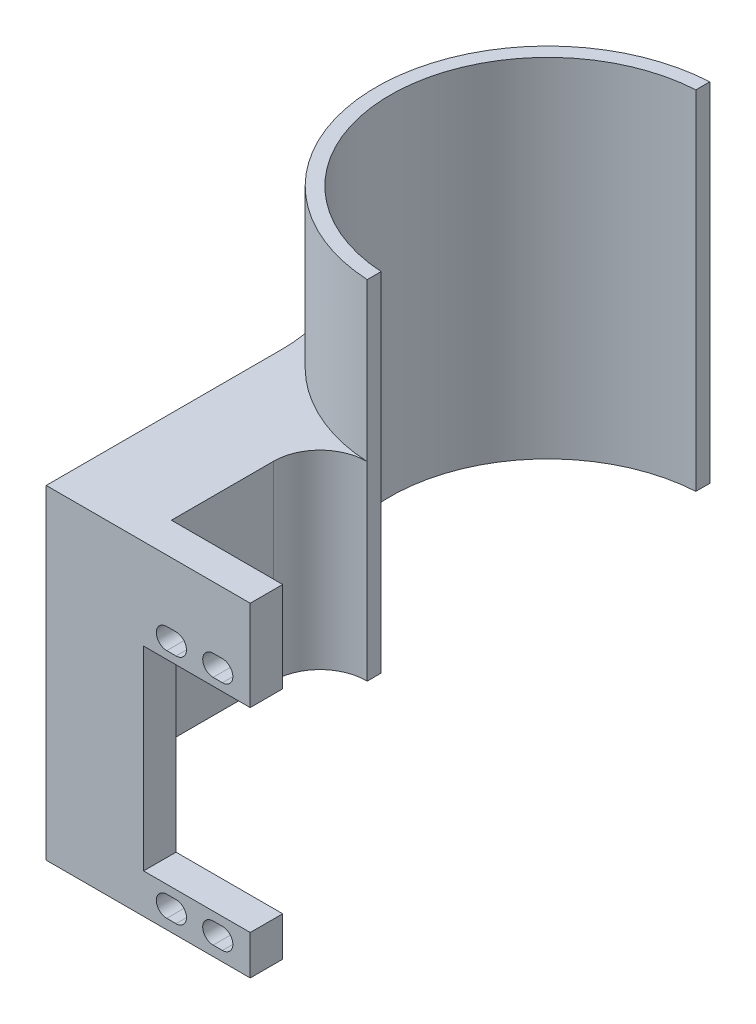
ISO-10303-21;
HEADER;
FILE_DESCRIPTION(('STEP AP214'),'2;1');
FILE_NAME('part.step','',(''),(''),'','','');
FILE_SCHEMA(('AUTOMOTIVE_DESIGN { 1 0 10303 214 1 1 1 1 }'));
ENDSEC;
DATA;
#1=APPLICATION_CONTEXT('core data for automotive mechanical design processes');
#2=APPLICATION_PROTOCOL_DEFINITION('international standard','automotive_design',2000,#1);
#3=PRODUCT_CONTEXT('',#1,'mechanical');
#4=PRODUCT('Part','Part','',(#3));
#5=PRODUCT_RELATED_PRODUCT_CATEGORY('part','',(#4));
#6=PRODUCT_DEFINITION_FORMATION('','',#4);
#7=PRODUCT_DEFINITION_CONTEXT('part definition',#1,'design');
#8=PRODUCT_DEFINITION('design','',#6,#7);
#9=PRODUCT_DEFINITION_SHAPE('','',#8);
#10=(LENGTH_UNIT() NAMED_UNIT(*) SI_UNIT(.MILLI.,.METRE.));
#11=(NAMED_UNIT(*) PLANE_ANGLE_UNIT() SI_UNIT($,.RADIAN.));
#12=(NAMED_UNIT(*) SI_UNIT($,.STERADIAN.) SOLID_ANGLE_UNIT());
#13=UNCERTAINTY_MEASURE_WITH_UNIT(LENGTH_MEASURE(1.E-05),#10,'distance_accuracy_value','');
#14=(GEOMETRIC_REPRESENTATION_CONTEXT(3) GLOBAL_UNCERTAINTY_ASSIGNED_CONTEXT((#13)) GLOBAL_UNIT_ASSIGNED_CONTEXT((#10,
#11,#12)) REPRESENTATION_CONTEXT('',''));
#15=CARTESIAN_POINT('',(0.,0.,0.));
#16=DIRECTION('',(0.,0.,1.));
#17=DIRECTION('',(1.,0.,0.));
#18=AXIS2_PLACEMENT_3D('',#15,#16,#17);
#19=CARTESIAN_POINT('',(11.9999999999999,-22.8999999999999,59.5761671920241));
#20=DIRECTION('',(1.,0.,0.));
#21=DIRECTION('',(0.,1.,0.));
#22=AXIS2_PLACEMENT_3D('',#19,#20,#21);
#23=PLANE('',#22);
#24=DIRECTION('',(0.,0.,-1.));
#25=VECTOR('',#24,1.);
#26=CARTESIAN_POINT('',(11.9999999999999,-42.4,59.5761671920242));
#27=LINE('',#26,#25);
#28=CARTESIAN_POINT('',(11.9999999999999,-42.4,59.5761671920242));
#29=VERTEX_POINT('',#28);
#30=CARTESIAN_POINT('',(11.9999999999999,-42.4,52.5761671920241));
#31=VERTEX_POINT('',#30);
#32=EDGE_CURVE('E395',#29,#31,#27,.T.);
#33=ORIENTED_EDGE('',*,*,#32,.T.);
#34=DIRECTION('',(0.,-1.,0.));
#35=VECTOR('',#34,1.);
#36=CARTESIAN_POINT('',(11.9999999999999,-22.8999999999999,52.5761671920241));
#37=LINE('',#36,#35);
#38=CARTESIAN_POINT('',(11.9999999999999,-22.8999999999999,52.5761671920241));
#39=VERTEX_POINT('',#38);
#40=EDGE_CURVE('E449',#39,#31,#37,.T.);
#41=ORIENTED_EDGE('',*,*,#40,.F.);
#42=DIRECTION('',(0.,0.,1.));
#43=VECTOR('',#42,1.);
#44=CARTESIAN_POINT('',(11.9999999999999,-22.8999999999999,59.5761671920241));
#45=LINE('',#44,#43);
#46=CARTESIAN_POINT('',(11.9999999999999,-22.8999999999999,59.5761671920241));
#47=VERTEX_POINT('',#46);
#48=EDGE_CURVE('E422',#39,#47,#45,.T.);
#49=ORIENTED_EDGE('',*,*,#48,.T.);
#50=DIRECTION('',(0.,-1.,0.));
#51=VECTOR('',#50,1.);
#52=CARTESIAN_POINT('',(11.9999999999999,-22.8999999999999,59.5761671920241));
#53=LINE('',#52,#51);
#54=EDGE_CURVE('E445',#47,#29,#53,.T.);
#55=ORIENTED_EDGE('',*,*,#54,.T.);
#56=EDGE_LOOP('',(#33,#41,#49,#55));
#57=FACE_BOUND('',#56,.T.);
#58=ADVANCED_FACE('F33',(#57),#23,.T.);
#59=CARTESIAN_POINT('',(-12.0000000000001,-22.9,52.5761671920241));
#60=DIRECTION('',(1.,0.,0.));
#61=DIRECTION('',(0.,1.,0.));
#62=AXIS2_PLACEMENT_3D('',#59,#60,#61);
#63=PLANE('',#62);
#64=DIRECTION('',(0.,0.,-1.));
#65=VECTOR('',#64,1.);
#66=CARTESIAN_POINT('',(-12.,-63.9,18.5158969481452));
#67=LINE('',#66,#65);
#68=CARTESIAN_POINT('',(-12.,-63.9,52.5761671920242));
#69=VERTEX_POINT('',#68);
#70=CARTESIAN_POINT('',(-12.,-63.9,30.5205603022688));
#71=VERTEX_POINT('',#70);
#72=EDGE_CURVE('E408',#69,#71,#67,.T.);
#73=ORIENTED_EDGE('',*,*,#72,.T.);
#74=DIRECTION('',(0.,-1.,0.));
#75=VECTOR('',#74,1.);
#76=CARTESIAN_POINT('',(-12.0000000000001,-22.9,30.5205603022688));
#77=LINE('',#76,#75);
#78=CARTESIAN_POINT('',(-12.0000000000001,-22.9,30.5205603022688));
#79=VERTEX_POINT('',#78);
#80=EDGE_CURVE('E497',#71,#79,#77,.F.);
#81=ORIENTED_EDGE('',*,*,#80,.T.);
#82=DIRECTION('',(0.,0.,1.));
#83=VECTOR('',#82,1.);
#84=CARTESIAN_POINT('',(-12.0000000000001,-22.9,52.5761671920241));
#85=LINE('',#84,#83);
#86=CARTESIAN_POINT('',(-12.0000000000001,-22.9,52.5761671920241));
#87=VERTEX_POINT('',#86);
#88=EDGE_CURVE('E416',#79,#87,#85,.T.);
#89=ORIENTED_EDGE('',*,*,#88,.T.);
#90=DIRECTION('',(0.,-1.,0.));
#91=VECTOR('',#90,1.);
#92=CARTESIAN_POINT('',(-12.0000000000001,-22.9,52.5761671920241));
#93=LINE('',#92,#91);
#94=EDGE_CURVE('E431',#87,#69,#93,.T.);
#95=ORIENTED_EDGE('',*,*,#94,.T.);
#96=EDGE_LOOP('',(#73,#81,#89,#95));
#97=FACE_BOUND('',#96,.T.);
#98=ADVANCED_FACE('F506',(#97),#63,.T.);
#99=CARTESIAN_POINT('',(0.173562069242392,-63.9,-16.4190588916441));
#100=DIRECTION('',(0.,1.,0.));
#101=DIRECTION('',(-1.,0.,0.));
#102=AXIS2_PLACEMENT_3D('',#99,#100,#101);
#103=CYLINDRICAL_SURFACE('',#102,34.);
#104=CARTESIAN_POINT('',(0.173562069242354,11.1,-16.4190588916441));
#105=DIRECTION('',(0.,1.,0.));
#106=DIRECTION('',(1.,0.,0.));
#107=AXIS2_PLACEMENT_3D('',#104,#105,#106);
#108=CIRCLE('',#107,34.);
#109=CARTESIAN_POINT('',(-1.82643793075764,11.1,-50.3601843885984));
#110=VERTEX_POINT('',#109);
#111=CARTESIAN_POINT('',(-1.82643793075765,11.1,17.5220666053102));
#112=VERTEX_POINT('',#111);
#113=EDGE_CURVE('E444',#110,#112,#108,.T.);
#114=ORIENTED_EDGE('',*,*,#113,.T.);
#115=DIRECTION('',(0.,1.,0.));
#116=VECTOR('',#115,1.);
#117=CARTESIAN_POINT('',(-1.82643793075761,-63.9,17.5220666053102));
#118=LINE('',#117,#116);
#119=CARTESIAN_POINT('',(-1.82643793075761,-63.9,17.5220666053102));
#120=VERTEX_POINT('',#119);
#121=EDGE_CURVE('E484',#120,#112,#118,.T.);
#122=ORIENTED_EDGE('',*,*,#121,.F.);
#123=CARTESIAN_POINT('',(0.173562069242392,-63.9,-16.4190588916441));
#124=DIRECTION('',(0.,1.,0.));
#125=DIRECTION('',(1.,0.,0.));
#126=AXIS2_PLACEMENT_3D('',#123,#124,#125);
#127=CIRCLE('',#126,34.);
#128=CARTESIAN_POINT('',(-1.8264379307576,-63.9,-50.3601843885984));
#129=VERTEX_POINT('',#128);
#130=EDGE_CURVE('E455',#129,#120,#127,.T.);
#131=ORIENTED_EDGE('',*,*,#130,.F.);
#132=DIRECTION('',(0.,1.,0.));
#133=VECTOR('',#132,1.);
#134=CARTESIAN_POINT('',(-1.8264379307576,-63.9,-50.3601843885984));
#135=LINE('',#134,#133);
#136=EDGE_CURVE('E466',#129,#110,#135,.T.);
#137=ORIENTED_EDGE('',*,*,#136,.T.);
#138=EDGE_LOOP('',(#114,#122,#131,#137));
#139=FACE_BOUND('',#138,.T.);
#140=ADVANCED_FACE('F571',(#139),#103,.F.);
#141=CARTESIAN_POINT('',(-1.82643793075761,-63.9,17.5220666053102));
#142=DIRECTION('',(-1.,0.,0.));
#143=DIRECTION('',(0.,-1.,0.));
#144=AXIS2_PLACEMENT_3D('',#141,#142,#143);
#145=PLANE('',#144);
#146=DIRECTION('',(0.,0.,1.));
#147=VECTOR('',#146,1.);
#148=CARTESIAN_POINT('',(-1.82643793075765,11.1,17.5220666053102));
#149=LINE('',#148,#147);
#150=CARTESIAN_POINT('',(-1.82643793075765,11.1,20.5220666053102));
#151=VERTEX_POINT('',#150);
#152=EDGE_CURVE('E469',#112,#151,#149,.T.);
#153=ORIENTED_EDGE('',*,*,#152,.T.);
#154=DIRECTION('',(0.,1.,0.));
#155=VECTOR('',#154,1.);
#156=CARTESIAN_POINT('',(-1.82643793075761,-63.9,20.5220666053102));
#157=LINE('',#156,#155);
#158=CARTESIAN_POINT('',(-1.82643793075764,-22.9,20.5220666053102));
#159=VERTEX_POINT('',#158);
#160=EDGE_CURVE('E480',#159,#151,#157,.T.);
#161=ORIENTED_EDGE('',*,*,#160,.F.);
#162=CARTESIAN_POINT('',(-1.82643793075761,-63.9,20.5220666053102));
#163=VERTEX_POINT('',#162);
#164=EDGE_CURVE('E481',#163,#159,#157,.T.);
#165=ORIENTED_EDGE('',*,*,#164,.F.);
#166=DIRECTION('',(0.,0.,1.));
#167=VECTOR('',#166,1.);
#168=CARTESIAN_POINT('',(-1.82643793075761,-63.9,17.5220666053102));
#169=LINE('',#168,#167);
#170=EDGE_CURVE('E458',#120,#163,#169,.T.);
#171=ORIENTED_EDGE('',*,*,#170,.F.);
#172=ORIENTED_EDGE('',*,*,#121,.T.);
#173=EDGE_LOOP('',(#153,#161,#165,#171,#172));
#174=FACE_BOUND('',#173,.T.);
#175=ADVANCED_FACE('F515',(#174),#145,.F.);
#176=CARTESIAN_POINT('',(0.173562069242392,-63.9,-16.4190588916441));
#177=DIRECTION('',(0.,1.,0.));
#178=DIRECTION('',(-1.,0.,0.));
#179=AXIS2_PLACEMENT_3D('',#176,#177,#178);
#180=CYLINDRICAL_SURFACE('',#179,36.9952260836682);
#181=CARTESIAN_POINT('',(0.173562069242283,-22.9,-16.4190588916441));
#182=DIRECTION('',(0.,1.,0.));
#183=DIRECTION('',(1.,0.,0.));
#184=AXIS2_PLACEMENT_3D('',#181,#182,#183);
#185=CIRCLE('',#184,36.9952260836682);
#186=CARTESIAN_POINT('',(-34.1591078781066,-22.9,-2.63811091016867));
#187=VERTEX_POINT('',#186);
#188=EDGE_CURVE('E414',#187,#159,#185,.T.);
#189=ORIENTED_EDGE('',*,*,#188,.T.);
#190=ORIENTED_EDGE('',*,*,#160,.T.);
#191=CARTESIAN_POINT('',(0.173562069242354,11.1,-16.4190588916441));
#192=DIRECTION('',(0.,-1.,0.));
#193=DIRECTION('',(1.,0.,0.));
#194=AXIS2_PLACEMENT_3D('',#191,#192,#193);
#195=CIRCLE('',#194,36.9952260836682);
#196=CARTESIAN_POINT('',(-1.82643793075764,11.1,-53.3601843885984));
#197=VERTEX_POINT('',#196);
#198=EDGE_CURVE('E472',#151,#197,#195,.T.);
#199=ORIENTED_EDGE('',*,*,#198,.T.);
#200=DIRECTION('',(0.,1.,0.));
#201=VECTOR('',#200,1.);
#202=CARTESIAN_POINT('',(-1.8264379307576,-63.9,-53.3601843885984));
#203=LINE('',#202,#201);
#204=CARTESIAN_POINT('',(-1.8264379307576,-63.9,-53.3601843885984));
#205=VERTEX_POINT('',#204);
#206=EDGE_CURVE('E477',#205,#197,#203,.T.);
#207=ORIENTED_EDGE('',*,*,#206,.F.);
#208=CARTESIAN_POINT('',(0.173562069242392,-63.9,-16.4190588916441));
#209=DIRECTION('',(0.,-1.,0.));
#210=DIRECTION('',(1.,0.,0.));
#211=AXIS2_PLACEMENT_3D('',#208,#209,#210);
#212=CIRCLE('',#211,36.9952260836682);
#213=CARTESIAN_POINT('',(-34.1591078781065,-63.9,-2.63811091016868));
#214=VERTEX_POINT('',#213);
#215=EDGE_CURVE('E462',#214,#205,#212,.T.);
#216=ORIENTED_EDGE('',*,*,#215,.F.);
#217=DIRECTION('',(0.,1.,0.));
#218=VECTOR('',#217,1.);
#219=CARTESIAN_POINT('',(-34.1591078781065,-63.9,-2.63811091016868));
#220=LINE('',#219,#218);
#221=EDGE_CURVE('E490',#214,#187,#220,.T.);
#222=ORIENTED_EDGE('',*,*,#221,.T.);
#223=EDGE_LOOP('',(#189,#190,#199,#207,#216,#222));
#224=FACE_BOUND('',#223,.T.);
#225=ADVANCED_FACE('F518',(#224),#180,.T.);
#226=CARTESIAN_POINT('',(-1.8264379307576,-63.9,-50.3601843885984));
#227=DIRECTION('',(-1.,0.,0.));
#228=DIRECTION('',(0.,-1.,0.));
#229=AXIS2_PLACEMENT_3D('',#226,#227,#228);
#230=PLANE('',#229);
#231=DIRECTION('',(0.,0.,1.));
#232=VECTOR('',#231,1.);
#233=CARTESIAN_POINT('',(-1.82643793075764,11.1,-50.3601843885984));
#234=LINE('',#233,#232);
#235=EDGE_CURVE('E459',#197,#110,#234,.T.);
#236=ORIENTED_EDGE('',*,*,#235,.T.);
#237=ORIENTED_EDGE('',*,*,#136,.F.);
#238=DIRECTION('',(0.,0.,1.));
#239=VECTOR('',#238,1.);
#240=CARTESIAN_POINT('',(-1.8264379307576,-63.9,-50.3601843885984));
#241=LINE('',#240,#239);
#242=EDGE_CURVE('E464',#205,#129,#241,.T.);
#243=ORIENTED_EDGE('',*,*,#242,.F.);
#244=ORIENTED_EDGE('',*,*,#206,.T.);
#245=EDGE_LOOP('',(#236,#237,#243,#244));
#246=FACE_BOUND('',#245,.T.);
#247=ADVANCED_FACE('F816',(#246),#230,.F.);
#248=CARTESIAN_POINT('',(0.173562069242392,-63.9,-16.4190588916441));
#249=DIRECTION('',(0.,-1.,0.));
#250=DIRECTION('',(1.,0.,0.));
#251=AXIS2_PLACEMENT_3D('',#248,#249,#250);
#252=PLANE('',#251);
#253=ORIENTED_EDGE('',*,*,#130,.T.);
#254=ORIENTED_EDGE('',*,*,#170,.T.);
#255=CARTESIAN_POINT('',(-2.00000000000003,-63.9,30.5205603022688));
#256=DIRECTION('',(0.,-1.,0.));
#257=DIRECTION('',(1.,0.,0.));
#258=AXIS2_PLACEMENT_3D('',#255,#256,#257);
#259=CIRCLE('',#258,10.);
#260=EDGE_CURVE('E41',#163,#71,#259,.F.);
#261=ORIENTED_EDGE('',*,*,#260,.T.);
#262=ORIENTED_EDGE('',*,*,#72,.F.);
#263=DIRECTION('',(1.,0.,0.));
#264=VECTOR('',#263,1.);
#265=CARTESIAN_POINT('',(-12.0000000000001,-63.9,52.5761671920242));
#266=LINE('',#265,#264);
#267=CARTESIAN_POINT('',(-32.0000000000001,-63.9,52.5761671920242));
#268=VERTEX_POINT('',#267);
#269=EDGE_CURVE('E404',#268,#69,#266,.T.);
#270=ORIENTED_EDGE('',*,*,#269,.F.);
#271=DIRECTION('',(0.,0.,1.));
#272=VECTOR('',#271,1.);
#273=CARTESIAN_POINT('',(-32.,-63.9,52.5761671920241));
#274=LINE('',#273,#272);
#275=CARTESIAN_POINT('',(-32.,-63.9,8.5370725718637));
#276=VERTEX_POINT('',#275);
#277=EDGE_CURVE('E406',#276,#268,#274,.T.);
#278=ORIENTED_EDGE('',*,*,#277,.F.);
#279=CARTESIAN_POINT('',(-62.,-63.9,8.53707257186369));
#280=DIRECTION('',(0.,-1.,0.));
#281=DIRECTION('',(1.,0.,0.));
#282=AXIS2_PLACEMENT_3D('',#279,#280,#281);
#283=CIRCLE('',#282,30.);
#284=EDGE_CURVE('E493',#276,#214,#283,.F.);
#285=ORIENTED_EDGE('',*,*,#284,.T.);
#286=ORIENTED_EDGE('',*,*,#215,.T.);
#287=ORIENTED_EDGE('',*,*,#242,.T.);
#288=EDGE_LOOP('',(#253,#254,#261,#262,#270,#278,#285,#286,#287));
#289=FACE_BOUND('',#288,.T.);
#290=ADVANCED_FACE('F500',(#289),#252,.T.);
#291=CARTESIAN_POINT('',(0.173562069242354,11.1,-16.4190588916441));
#292=DIRECTION('',(0.,-1.,0.));
#293=DIRECTION('',(1.,0.,0.));
#294=AXIS2_PLACEMENT_3D('',#291,#292,#293);
#295=PLANE('',#294);
#296=ORIENTED_EDGE('',*,*,#113,.F.);
#297=ORIENTED_EDGE('',*,*,#235,.F.);
#298=ORIENTED_EDGE('',*,*,#198,.F.);
#299=ORIENTED_EDGE('',*,*,#152,.F.);
#300=EDGE_LOOP('',(#296,#297,#298,#299));
#301=FACE_BOUND('',#300,.T.);
#302=ADVANCED_FACE('F584',(#301),#295,.F.);
#303=CARTESIAN_POINT('',(-32.0000000000001,-22.9,1.84316049041164));
#304=DIRECTION('',(-1.,0.,0.));
#305=DIRECTION('',(0.,-1.,0.));
#306=AXIS2_PLACEMENT_3D('',#303,#304,#305);
#307=PLANE('',#306);
#308=DIRECTION('',(0.,0.,-1.));
#309=VECTOR('',#308,1.);
#310=CARTESIAN_POINT('',(-32.0000000000001,-22.9,1.84316049041164));
#311=LINE('',#310,#309);
#312=CARTESIAN_POINT('',(-32.0000000000001,-22.9,59.5761671920241));
#313=VERTEX_POINT('',#312);
#314=CARTESIAN_POINT('',(-32.0000000000001,-22.9,8.5370725718637));
#315=VERTEX_POINT('',#314);
#316=EDGE_CURVE('E428',#313,#315,#311,.T.);
#317=ORIENTED_EDGE('',*,*,#316,.T.);
#318=DIRECTION('',(0.,1.,0.));
#319=VECTOR('',#318,1.);
#320=CARTESIAN_POINT('',(-32.0000000000001,-22.9,8.5370725718637));
#321=LINE('',#320,#319);
#322=EDGE_CURVE('E487',#315,#276,#321,.F.);
#323=ORIENTED_EDGE('',*,*,#322,.T.);
#324=ORIENTED_EDGE('',*,*,#277,.T.);
#325=DIRECTION('',(0.,-1.,0.));
#326=VECTOR('',#325,1.);
#327=CARTESIAN_POINT('',(-32.0000000000001,-9.3670927880618,52.5761671920241));
#328=LINE('',#327,#326);
#329=CARTESIAN_POINT('',(-32.,-92.9,52.5761671920242));
#330=VERTEX_POINT('',#329);
#331=EDGE_CURVE('E398',#268,#330,#328,.T.);
#332=ORIENTED_EDGE('',*,*,#331,.T.);
#333=DIRECTION('',(0.,0.,-1.));
#334=VECTOR('',#333,1.);
#335=CARTESIAN_POINT('',(-32.,-92.9,1.84316049041168));
#336=LINE('',#335,#334);
#337=CARTESIAN_POINT('',(-32.,-92.9,59.5761671920242));
#338=VERTEX_POINT('',#337);
#339=EDGE_CURVE('E417',#338,#330,#336,.T.);
#340=ORIENTED_EDGE('',*,*,#339,.F.);
#341=DIRECTION('',(0.,-1.,0.));
#342=VECTOR('',#341,1.);
#343=CARTESIAN_POINT('',(-32.0000000000001,-22.9,59.5761671920241));
#344=LINE('',#343,#342);
#345=EDGE_CURVE('E442',#313,#338,#344,.T.);
#346=ORIENTED_EDGE('',*,*,#345,.F.);
#347=EDGE_LOOP('',(#317,#323,#324,#332,#340,#346));
#348=FACE_BOUND('',#347,.T.);
#349=ADVANCED_FACE('F529',(#348),#307,.T.);
#350=CARTESIAN_POINT('',(-32.0000000000001,-22.9,59.5761671920241));
#351=DIRECTION('',(0.,0.,1.));
#352=DIRECTION('',(0.,-1.,0.));
#353=AXIS2_PLACEMENT_3D('',#350,#351,#352);
#354=PLANE('',#353);
#355=CARTESIAN_POINT('',(-4.00000000000004,-88.5,59.5761671920242));
#356=DIRECTION('',(0.,0.,-1.));
#357=DIRECTION('',(0.,1.,0.));
#358=AXIS2_PLACEMENT_3D('',#355,#356,#357);
#359=CIRCLE('',#358,2.25);
#360=CARTESIAN_POINT('',(-4.00000000000004,-86.25,59.5761671920242));
#361=VERTEX_POINT('',#360);
#362=CARTESIAN_POINT('',(-4.00000000000004,-90.75,59.5761671920242));
#363=VERTEX_POINT('',#362);
#364=EDGE_CURVE('E247',#361,#363,#359,.T.);
#365=ORIENTED_EDGE('',*,*,#364,.T.);
#366=DIRECTION('',(-1.,0.,0.));
#367=VECTOR('',#366,1.);
#368=CARTESIAN_POINT('',(-4.00000000000004,-90.75,59.5761671920242));
#369=LINE('',#368,#367);
#370=CARTESIAN_POINT('',(-6.00000000000004,-90.75,59.5761671920242));
#371=VERTEX_POINT('',#370);
#372=EDGE_CURVE('E256',#363,#371,#369,.T.);
#373=ORIENTED_EDGE('',*,*,#372,.T.);
#374=CARTESIAN_POINT('',(-6.00000000000004,-88.5,59.5761671920242));
#375=DIRECTION('',(0.,0.,-1.));
#376=DIRECTION('',(0.,1.,0.));
#377=AXIS2_PLACEMENT_3D('',#374,#375,#376);
#378=CIRCLE('',#377,2.25);
#379=CARTESIAN_POINT('',(-6.00000000000004,-86.25,59.5761671920242));
#380=VERTEX_POINT('',#379);
#381=EDGE_CURVE('E48',#371,#380,#378,.T.);
#382=ORIENTED_EDGE('',*,*,#381,.T.);
#383=DIRECTION('',(1.,0.,0.));
#384=VECTOR('',#383,1.);
#385=CARTESIAN_POINT('',(-4.00000000000004,-86.25,59.5761671920242));
#386=LINE('',#385,#384);
#387=EDGE_CURVE('E253',#380,#361,#386,.T.);
#388=ORIENTED_EDGE('',*,*,#387,.T.);
#389=EDGE_LOOP('',(#365,#373,#382,#388));
#390=FACE_BOUND('',#389,.T.);
#391=CARTESIAN_POINT('',(5.99999999999996,-88.5,59.5761671920242));
#392=DIRECTION('',(0.,0.,-1.));
#393=DIRECTION('',(0.,1.,0.));
#394=AXIS2_PLACEMENT_3D('',#391,#392,#393);
#395=CIRCLE('',#394,2.25);
#396=CARTESIAN_POINT('',(5.99999999999996,-86.25,59.5761671920242));
#397=VERTEX_POINT('',#396);
#398=CARTESIAN_POINT('',(5.99999999999996,-90.75,59.5761671920242));
#399=VERTEX_POINT('',#398);
#400=EDGE_CURVE('E282',#397,#399,#395,.T.);
#401=ORIENTED_EDGE('',*,*,#400,.T.);
#402=DIRECTION('',(-1.,0.,0.));
#403=VECTOR('',#402,1.);
#404=CARTESIAN_POINT('',(5.99999999999996,-90.75,59.5761671920242));
#405=LINE('',#404,#403);
#406=CARTESIAN_POINT('',(3.99999999999996,-90.75,59.5761671920242));
#407=VERTEX_POINT('',#406);
#408=EDGE_CURVE('E285',#399,#407,#405,.T.);
#409=ORIENTED_EDGE('',*,*,#408,.T.);
#410=CARTESIAN_POINT('',(3.99999999999996,-88.5,59.5761671920242));
#411=DIRECTION('',(0.,0.,-1.));
#412=DIRECTION('',(0.,1.,0.));
#413=AXIS2_PLACEMENT_3D('',#410,#411,#412);
#414=CIRCLE('',#413,2.25);
#415=CARTESIAN_POINT('',(3.99999999999996,-86.25,59.5761671920242));
#416=VERTEX_POINT('',#415);
#417=EDGE_CURVE('E289',#407,#416,#414,.T.);
#418=ORIENTED_EDGE('',*,*,#417,.T.);
#419=DIRECTION('',(1.,0.,0.));
#420=VECTOR('',#419,1.);
#421=CARTESIAN_POINT('',(5.99999999999996,-86.25,59.5761671920242));
#422=LINE('',#421,#420);
#423=EDGE_CURVE('E292',#416,#397,#422,.T.);
#424=ORIENTED_EDGE('',*,*,#423,.T.);
#425=EDGE_LOOP('',(#401,#409,#418,#424));
#426=FACE_BOUND('',#425,.T.);
#427=CARTESIAN_POINT('',(-4.00000000000003,-38.5,59.5761671920242));
#428=DIRECTION('',(0.,0.,-1.));
#429=DIRECTION('',(0.,1.,0.));
#430=AXIS2_PLACEMENT_3D('',#427,#428,#429);
#431=CIRCLE('',#430,2.25);
#432=CARTESIAN_POINT('',(-4.00000000000003,-36.25,59.5761671920242));
#433=VERTEX_POINT('',#432);
#434=CARTESIAN_POINT('',(-4.00000000000003,-40.75,59.5761671920242));
#435=VERTEX_POINT('',#434);
#436=EDGE_CURVE('E314',#433,#435,#431,.T.);
#437=ORIENTED_EDGE('',*,*,#436,.T.);
#438=DIRECTION('',(-1.,0.,0.));
#439=VECTOR('',#438,1.);
#440=CARTESIAN_POINT('',(-4.00000000000003,-40.75,59.5761671920242));
#441=LINE('',#440,#439);
#442=CARTESIAN_POINT('',(-6.00000000000003,-40.75,59.5761671920241));
#443=VERTEX_POINT('',#442);
#444=EDGE_CURVE('E317',#435,#443,#441,.T.);
#445=ORIENTED_EDGE('',*,*,#444,.T.);
#446=CARTESIAN_POINT('',(-6.00000000000003,-38.5,59.5761671920242));
#447=DIRECTION('',(0.,0.,-1.));
#448=DIRECTION('',(0.,1.,0.));
#449=AXIS2_PLACEMENT_3D('',#446,#447,#448);
#450=CIRCLE('',#449,2.25);
#451=CARTESIAN_POINT('',(-6.00000000000003,-36.25,59.5761671920242));
#452=VERTEX_POINT('',#451);
#453=EDGE_CURVE('E321',#443,#452,#450,.T.);
#454=ORIENTED_EDGE('',*,*,#453,.T.);
#455=DIRECTION('',(1.,0.,0.));
#456=VECTOR('',#455,1.);
#457=CARTESIAN_POINT('',(-4.00000000000003,-36.25,59.5761671920242));
#458=LINE('',#457,#456);
#459=EDGE_CURVE('E324',#452,#433,#458,.T.);
#460=ORIENTED_EDGE('',*,*,#459,.T.);
#461=EDGE_LOOP('',(#437,#445,#454,#460));
#462=FACE_BOUND('',#461,.T.);
#463=CARTESIAN_POINT('',(5.99999999999997,-38.5,59.5761671920242));
#464=DIRECTION('',(0.,0.,-1.));
#465=DIRECTION('',(0.,1.,0.));
#466=AXIS2_PLACEMENT_3D('',#463,#464,#465);
#467=CIRCLE('',#466,2.25);
#468=CARTESIAN_POINT('',(5.99999999999997,-36.25,59.5761671920242));
#469=VERTEX_POINT('',#468);
#470=CARTESIAN_POINT('',(5.99999999999997,-40.75,59.5761671920242));
#471=VERTEX_POINT('',#470);
#472=EDGE_CURVE('E346',#469,#471,#467,.T.);
#473=ORIENTED_EDGE('',*,*,#472,.T.);
#474=DIRECTION('',(-1.,0.,0.));
#475=VECTOR('',#474,1.);
#476=CARTESIAN_POINT('',(5.99999999999997,-40.75,59.5761671920242));
#477=LINE('',#476,#475);
#478=CARTESIAN_POINT('',(3.99999999999997,-40.75,59.5761671920241));
#479=VERTEX_POINT('',#478);
#480=EDGE_CURVE('E349',#471,#479,#477,.T.);
#481=ORIENTED_EDGE('',*,*,#480,.T.);
#482=CARTESIAN_POINT('',(3.99999999999997,-38.5,59.5761671920242));
#483=DIRECTION('',(0.,0.,-1.));
#484=DIRECTION('',(0.,1.,0.));
#485=AXIS2_PLACEMENT_3D('',#482,#483,#484);
#486=CIRCLE('',#485,2.25);
#487=CARTESIAN_POINT('',(3.99999999999997,-36.25,59.5761671920242));
#488=VERTEX_POINT('',#487);
#489=EDGE_CURVE('E353',#479,#488,#486,.T.);
#490=ORIENTED_EDGE('',*,*,#489,.T.);
#491=DIRECTION('',(1.,0.,0.));
#492=VECTOR('',#491,1.);
#493=CARTESIAN_POINT('',(5.99999999999997,-36.25,59.5761671920242));
#494=LINE('',#493,#492);
#495=EDGE_CURVE('E356',#488,#469,#494,.T.);
#496=ORIENTED_EDGE('',*,*,#495,.T.);
#497=EDGE_LOOP('',(#473,#481,#490,#496));
#498=FACE_BOUND('',#497,.T.);
#499=DIRECTION('',(1.,0.,0.));
#500=VECTOR('',#499,1.);
#501=CARTESIAN_POINT('',(11.9999999999999,-42.4,59.5761671920242));
#502=LINE('',#501,#500);
#503=CARTESIAN_POINT('',(-11.,-42.4,59.5761671920242));
#504=VERTEX_POINT('',#503);
#505=EDGE_CURVE('E385',#504,#29,#502,.T.);
#506=ORIENTED_EDGE('',*,*,#505,.T.);
#507=ORIENTED_EDGE('',*,*,#54,.F.);
#508=DIRECTION('',(-1.,0.,0.));
#509=VECTOR('',#508,1.);
#510=CARTESIAN_POINT('',(-32.0000000000001,-22.9,59.5761671920241));
#511=LINE('',#510,#509);
#512=EDGE_CURVE('E425',#47,#313,#511,.T.);
#513=ORIENTED_EDGE('',*,*,#512,.T.);
#514=ORIENTED_EDGE('',*,*,#345,.T.);
#515=DIRECTION('',(-1.,0.,0.));
#516=VECTOR('',#515,1.);
#517=CARTESIAN_POINT('',(-32.,-92.9,59.5761671920242));
#518=LINE('',#517,#516);
#519=CARTESIAN_POINT('',(12.,-92.8999999999999,59.5761671920242));
#520=VERTEX_POINT('',#519);
#521=EDGE_CURVE('E437',#520,#338,#518,.T.);
#522=ORIENTED_EDGE('',*,*,#521,.F.);
#523=CARTESIAN_POINT('',(11.9999999999999,-84.4,59.5761671920242));
#524=VERTEX_POINT('',#523);
#525=EDGE_CURVE('E448',#524,#520,#53,.T.);
#526=ORIENTED_EDGE('',*,*,#525,.F.);
#527=DIRECTION('',(-1.,0.,0.));
#528=VECTOR('',#527,1.);
#529=CARTESIAN_POINT('',(11.9999999999999,-84.4,59.5761671920242));
#530=LINE('',#529,#528);
#531=CARTESIAN_POINT('',(-11.,-84.4,59.5761671920242));
#532=VERTEX_POINT('',#531);
#533=EDGE_CURVE('E378',#524,#532,#530,.T.);
#534=ORIENTED_EDGE('',*,*,#533,.T.);
#535=DIRECTION('',(0.,1.,0.));
#536=VECTOR('',#535,1.);
#537=CARTESIAN_POINT('',(-11.,-42.4,59.5761671920242));
#538=LINE('',#537,#536);
#539=EDGE_CURVE('E381',#532,#504,#538,.T.);
#540=ORIENTED_EDGE('',*,*,#539,.T.);
#541=EDGE_LOOP('',(#506,#507,#513,#514,#522,#526,#534,#540));
#542=FACE_BOUND('',#541,.T.);
#543=ADVANCED_FACE('F260',(#390,#426,#462,#498,#542),#354,.T.);
#544=DIRECTION('',(0.,0.,-1.));
#545=VECTOR('',#544,1.);
#546=CARTESIAN_POINT('',(11.9999999999999,-84.4,59.5761671920242));
#547=LINE('',#546,#545);
#548=CARTESIAN_POINT('',(12.,-84.4,52.5761671920242));
#549=VERTEX_POINT('',#548);
#550=EDGE_CURVE('E388',#524,#549,#547,.T.);
#551=ORIENTED_EDGE('',*,*,#550,.F.);
#552=ORIENTED_EDGE('',*,*,#525,.T.);
#553=DIRECTION('',(0.,0.,1.));
#554=VECTOR('',#553,1.);
#555=CARTESIAN_POINT('',(12.,-92.8999999999999,59.5761671920242));
#556=LINE('',#555,#554);
#557=CARTESIAN_POINT('',(12.,-92.8999999999999,52.5761671920242));
#558=VERTEX_POINT('',#557);
#559=EDGE_CURVE('E434',#558,#520,#556,.T.);
#560=ORIENTED_EDGE('',*,*,#559,.F.);
#561=EDGE_CURVE('E452',#549,#558,#37,.T.);
#562=ORIENTED_EDGE('',*,*,#561,.F.);
#563=EDGE_LOOP('',(#551,#552,#560,#562));
#564=FACE_BOUND('',#563,.T.);
#565=ADVANCED_FACE('F547',(#564),#23,.T.);
#566=CARTESIAN_POINT('',(11.9999999999999,-22.8999999999999,52.5761671920241));
#567=DIRECTION('',(0.,0.,-1.));
#568=DIRECTION('',(-1.,0.,0.));
#569=AXIS2_PLACEMENT_3D('',#566,#567,#568);
#570=PLANE('',#569);
#571=CARTESIAN_POINT('',(-4.00000000000004,-88.5,52.5761671920242));
#572=DIRECTION('',(0.,0.,-1.));
#573=DIRECTION('',(0.,1.,0.));
#574=AXIS2_PLACEMENT_3D('',#571,#572,#573);
#575=CIRCLE('',#574,2.25);
#576=CARTESIAN_POINT('',(-4.00000000000004,-86.25,52.5761671920242));
#577=VERTEX_POINT('',#576);
#578=CARTESIAN_POINT('',(-4.00000000000005,-90.75,52.5761671920242));
#579=VERTEX_POINT('',#578);
#580=EDGE_CURVE('E56',#577,#579,#575,.T.);
#581=ORIENTED_EDGE('',*,*,#580,.F.);
#582=DIRECTION('',(1.,0.,0.));
#583=VECTOR('',#582,1.);
#584=CARTESIAN_POINT('',(-4.00000000000004,-86.25,52.5761671920242));
#585=LINE('',#584,#583);
#586=CARTESIAN_POINT('',(-6.00000000000004,-86.25,52.5761671920242));
#587=VERTEX_POINT('',#586);
#588=EDGE_CURVE('E263',#587,#577,#585,.T.);
#589=ORIENTED_EDGE('',*,*,#588,.F.);
#590=CARTESIAN_POINT('',(-6.00000000000004,-88.5,52.5761671920242));
#591=DIRECTION('',(0.,0.,-1.));
#592=DIRECTION('',(0.,1.,0.));
#593=AXIS2_PLACEMENT_3D('',#590,#591,#592);
#594=CIRCLE('',#593,2.25);
#595=CARTESIAN_POINT('',(-6.00000000000004,-90.75,52.5761671920242));
#596=VERTEX_POINT('',#595);
#597=EDGE_CURVE('E266',#596,#587,#594,.T.);
#598=ORIENTED_EDGE('',*,*,#597,.F.);
#599=DIRECTION('',(-1.,0.,0.));
#600=VECTOR('',#599,1.);
#601=CARTESIAN_POINT('',(-4.00000000000004,-90.75,52.5761671920242));
#602=LINE('',#601,#600);
#603=EDGE_CURVE('E272',#579,#596,#602,.T.);
#604=ORIENTED_EDGE('',*,*,#603,.F.);
#605=EDGE_LOOP('',(#581,#589,#598,#604));
#606=FACE_BOUND('',#605,.T.);
#607=CARTESIAN_POINT('',(5.99999999999996,-88.5,52.5761671920242));
#608=DIRECTION('',(0.,0.,-1.));
#609=DIRECTION('',(0.,1.,0.));
#610=AXIS2_PLACEMENT_3D('',#607,#608,#609);
#611=CIRCLE('',#610,2.25);
#612=CARTESIAN_POINT('',(5.99999999999996,-86.25,52.5761671920242));
#613=VERTEX_POINT('',#612);
#614=CARTESIAN_POINT('',(5.99999999999996,-90.75,52.5761671920242));
#615=VERTEX_POINT('',#614);
#616=EDGE_CURVE('E278',#613,#615,#611,.T.);
#617=ORIENTED_EDGE('',*,*,#616,.F.);
#618=DIRECTION('',(1.,0.,0.));
#619=VECTOR('',#618,1.);
#620=CARTESIAN_POINT('',(5.99999999999996,-86.25,52.5761671920242));
#621=LINE('',#620,#619);
#622=CARTESIAN_POINT('',(3.99999999999996,-86.25,52.5761671920242));
#623=VERTEX_POINT('',#622);
#624=EDGE_CURVE('E286',#623,#613,#621,.T.);
#625=ORIENTED_EDGE('',*,*,#624,.F.);
#626=CARTESIAN_POINT('',(3.99999999999996,-88.5,52.5761671920242));
#627=DIRECTION('',(0.,0.,-1.));
#628=DIRECTION('',(0.,1.,0.));
#629=AXIS2_PLACEMENT_3D('',#626,#627,#628);
#630=CIRCLE('',#629,2.25);
#631=CARTESIAN_POINT('',(3.99999999999996,-90.75,52.5761671920242));
#632=VERTEX_POINT('',#631);
#633=EDGE_CURVE('E300',#632,#623,#630,.T.);
#634=ORIENTED_EDGE('',*,*,#633,.F.);
#635=DIRECTION('',(-1.,0.,0.));
#636=VECTOR('',#635,1.);
#637=CARTESIAN_POINT('',(5.99999999999996,-90.75,52.5761671920242));
#638=LINE('',#637,#636);
#639=EDGE_CURVE('E297',#615,#632,#638,.T.);
#640=ORIENTED_EDGE('',*,*,#639,.F.);
#641=EDGE_LOOP('',(#617,#625,#634,#640));
#642=FACE_BOUND('',#641,.T.);
#643=CARTESIAN_POINT('',(-4.00000000000003,-38.5,52.5761671920241));
#644=DIRECTION('',(0.,0.,-1.));
#645=DIRECTION('',(0.,1.,0.));
#646=AXIS2_PLACEMENT_3D('',#643,#644,#645);
#647=CIRCLE('',#646,2.25);
#648=CARTESIAN_POINT('',(-4.00000000000003,-36.25,52.5761671920241));
#649=VERTEX_POINT('',#648);
#650=CARTESIAN_POINT('',(-4.00000000000003,-40.75,52.5761671920241));
#651=VERTEX_POINT('',#650);
#652=EDGE_CURVE('E307',#649,#651,#647,.T.);
#653=ORIENTED_EDGE('',*,*,#652,.F.);
#654=DIRECTION('',(1.,0.,0.));
#655=VECTOR('',#654,1.);
#656=CARTESIAN_POINT('',(-4.00000000000003,-36.25,52.5761671920241));
#657=LINE('',#656,#655);
#658=CARTESIAN_POINT('',(-6.00000000000003,-36.25,52.5761671920241));
#659=VERTEX_POINT('',#658);
#660=EDGE_CURVE('E318',#659,#649,#657,.T.);
#661=ORIENTED_EDGE('',*,*,#660,.F.);
#662=CARTESIAN_POINT('',(-6.00000000000003,-38.5,52.5761671920241));
#663=DIRECTION('',(0.,0.,-1.));
#664=DIRECTION('',(0.,1.,0.));
#665=AXIS2_PLACEMENT_3D('',#662,#663,#664);
#666=CIRCLE('',#665,2.25);
#667=CARTESIAN_POINT('',(-6.00000000000003,-40.75,52.5761671920241));
#668=VERTEX_POINT('',#667);
#669=EDGE_CURVE('E332',#668,#659,#666,.T.);
#670=ORIENTED_EDGE('',*,*,#669,.F.);
#671=DIRECTION('',(-1.,0.,0.));
#672=VECTOR('',#671,1.);
#673=CARTESIAN_POINT('',(-4.00000000000003,-40.75,52.5761671920241));
#674=LINE('',#673,#672);
#675=EDGE_CURVE('E329',#651,#668,#674,.T.);
#676=ORIENTED_EDGE('',*,*,#675,.F.);
#677=EDGE_LOOP('',(#653,#661,#670,#676));
#678=FACE_BOUND('',#677,.T.);
#679=CARTESIAN_POINT('',(5.99999999999997,-38.5,52.5761671920241));
#680=DIRECTION('',(0.,0.,-1.));
#681=DIRECTION('',(0.,1.,0.));
#682=AXIS2_PLACEMENT_3D('',#679,#680,#681);
#683=CIRCLE('',#682,2.25);
#684=CARTESIAN_POINT('',(5.99999999999997,-36.25,52.5761671920241));
#685=VERTEX_POINT('',#684);
#686=CARTESIAN_POINT('',(5.99999999999997,-40.75,52.5761671920241));
#687=VERTEX_POINT('',#686);
#688=EDGE_CURVE('E339',#685,#687,#683,.T.);
#689=ORIENTED_EDGE('',*,*,#688,.F.);
#690=DIRECTION('',(1.,0.,0.));
#691=VECTOR('',#690,1.);
#692=CARTESIAN_POINT('',(5.99999999999997,-36.25,52.5761671920241));
#693=LINE('',#692,#691);
#694=CARTESIAN_POINT('',(3.99999999999997,-36.25,52.5761671920241));
#695=VERTEX_POINT('',#694);
#696=EDGE_CURVE('E350',#695,#685,#693,.T.);
#697=ORIENTED_EDGE('',*,*,#696,.F.);
#698=CARTESIAN_POINT('',(3.99999999999997,-38.5,52.5761671920241));
#699=DIRECTION('',(0.,0.,-1.));
#700=DIRECTION('',(0.,1.,0.));
#701=AXIS2_PLACEMENT_3D('',#698,#699,#700);
#702=CIRCLE('',#701,2.25);
#703=CARTESIAN_POINT('',(3.99999999999997,-40.75,52.5761671920241));
#704=VERTEX_POINT('',#703);
#705=EDGE_CURVE('E364',#704,#695,#702,.T.);
#706=ORIENTED_EDGE('',*,*,#705,.F.);
#707=DIRECTION('',(-1.,0.,0.));
#708=VECTOR('',#707,1.);
#709=CARTESIAN_POINT('',(5.99999999999997,-40.75,52.5761671920241));
#710=LINE('',#709,#708);
#711=EDGE_CURVE('E361',#687,#704,#710,.T.);
#712=ORIENTED_EDGE('',*,*,#711,.F.);
#713=EDGE_LOOP('',(#689,#697,#706,#712));
#714=FACE_BOUND('',#713,.T.);
#715=DIRECTION('',(1.,0.,0.));
#716=VECTOR('',#715,1.);
#717=CARTESIAN_POINT('',(11.9999999999999,-42.4,52.5761671920241));
#718=LINE('',#717,#716);
#719=CARTESIAN_POINT('',(-11.,-42.4,52.5761671920241));
#720=VERTEX_POINT('',#719);
#721=EDGE_CURVE('E382',#720,#31,#718,.T.);
#722=ORIENTED_EDGE('',*,*,#721,.F.);
#723=DIRECTION('',(0.,1.,0.));
#724=VECTOR('',#723,1.);
#725=CARTESIAN_POINT('',(-11.,-42.4,52.5761671920241));
#726=LINE('',#725,#724);
#727=CARTESIAN_POINT('',(-11.,-84.4,52.5761671920242));
#728=VERTEX_POINT('',#727);
#729=EDGE_CURVE('E391',#728,#720,#726,.T.);
#730=ORIENTED_EDGE('',*,*,#729,.F.);
#731=DIRECTION('',(-1.,0.,0.));
#732=VECTOR('',#731,1.);
#733=CARTESIAN_POINT('',(11.9999999999999,-84.4,52.5761671920242));
#734=LINE('',#733,#732);
#735=EDGE_CURVE('E371',#549,#728,#734,.T.);
#736=ORIENTED_EDGE('',*,*,#735,.F.);
#737=ORIENTED_EDGE('',*,*,#561,.T.);
#738=DIRECTION('',(1.,0.,0.));
#739=VECTOR('',#738,1.);
#740=CARTESIAN_POINT('',(12.,-92.8999999999999,52.5761671920242));
#741=LINE('',#740,#739);
#742=EDGE_CURVE('E413',#330,#558,#741,.T.);
#743=ORIENTED_EDGE('',*,*,#742,.F.);
#744=ORIENTED_EDGE('',*,*,#331,.F.);
#745=ORIENTED_EDGE('',*,*,#269,.T.);
#746=ORIENTED_EDGE('',*,*,#94,.F.);
#747=DIRECTION('',(1.,0.,0.));
#748=VECTOR('',#747,1.);
#749=CARTESIAN_POINT('',(11.9999999999999,-22.8999999999999,52.5761671920241));
#750=LINE('',#749,#748);
#751=EDGE_CURVE('E419',#87,#39,#750,.T.);
#752=ORIENTED_EDGE('',*,*,#751,.T.);
#753=ORIENTED_EDGE('',*,*,#40,.T.);
#754=EDGE_LOOP('',(#722,#730,#736,#737,#743,#744,#745,#746,#752,#753));
#755=FACE_BOUND('',#754,.T.);
#756=ADVANCED_FACE('F538',(#606,#642,#678,#714,#755),#570,.T.);
#757=CARTESIAN_POINT('',(0.173562069242283,-22.9,-16.4190588916441));
#758=DIRECTION('',(0.,-1.,0.));
#759=DIRECTION('',(1.,0.,0.));
#760=AXIS2_PLACEMENT_3D('',#757,#758,#759);
#761=PLANE('',#760);
#762=ORIENTED_EDGE('',*,*,#188,.F.);
#763=CARTESIAN_POINT('',(-62.,-22.9000000000001,8.53707257186369));
#764=DIRECTION('',(0.,-1.,0.));
#765=DIRECTION('',(1.,0.,0.));
#766=AXIS2_PLACEMENT_3D('',#763,#764,#765);
#767=CIRCLE('',#766,30.);
#768=EDGE_CURVE('E495',#187,#315,#767,.T.);
#769=ORIENTED_EDGE('',*,*,#768,.T.);
#770=ORIENTED_EDGE('',*,*,#316,.F.);
#771=ORIENTED_EDGE('',*,*,#512,.F.);
#772=ORIENTED_EDGE('',*,*,#48,.F.);
#773=ORIENTED_EDGE('',*,*,#751,.F.);
#774=ORIENTED_EDGE('',*,*,#88,.F.);
#775=CARTESIAN_POINT('',(-2.00000000000005,-22.9,30.5205603022688));
#776=DIRECTION('',(0.,-1.,0.));
#777=DIRECTION('',(1.,0.,0.));
#778=AXIS2_PLACEMENT_3D('',#775,#776,#777);
#779=CIRCLE('',#778,10.);
#780=EDGE_CURVE('E11',#79,#159,#779,.T.);
#781=ORIENTED_EDGE('',*,*,#780,.T.);
#782=EDGE_LOOP('',(#762,#769,#770,#771,#772,#773,#774,#781));
#783=FACE_BOUND('',#782,.T.);
#784=ADVANCED_FACE('F512',(#783),#761,.F.);
#785=CARTESIAN_POINT('',(0.173562069242377,-92.9,-16.4190588916441));
#786=DIRECTION('',(0.,-1.,0.));
#787=DIRECTION('',(1.,0.,0.));
#788=AXIS2_PLACEMENT_3D('',#785,#786,#787);
#789=PLANE('',#788);
#790=ORIENTED_EDGE('',*,*,#339,.T.);
#791=ORIENTED_EDGE('',*,*,#742,.T.);
#792=ORIENTED_EDGE('',*,*,#559,.T.);
#793=ORIENTED_EDGE('',*,*,#521,.T.);
#794=EDGE_LOOP('',(#790,#791,#792,#793));
#795=FACE_BOUND('',#794,.T.);
#796=ADVANCED_FACE('F542',(#795),#789,.T.);
#797=CARTESIAN_POINT('',(-62.,-63.9000000000001,8.53707257186369));
#798=DIRECTION('',(0.,1.,0.));
#799=DIRECTION('',(-1.,0.,0.));
#800=AXIS2_PLACEMENT_3D('',#797,#798,#799);
#801=CYLINDRICAL_SURFACE('',#800,30.);
#802=ORIENTED_EDGE('',*,*,#768,.F.);
#803=ORIENTED_EDGE('',*,*,#221,.F.);
#804=ORIENTED_EDGE('',*,*,#284,.F.);
#805=ORIENTED_EDGE('',*,*,#322,.F.);
#806=EDGE_LOOP('',(#802,#803,#804,#805));
#807=FACE_BOUND('',#806,.T.);
#808=ADVANCED_FACE('F525',(#807),#801,.F.);
#809=CARTESIAN_POINT('',(-2.00000000000003,-63.9,30.5205603022688));
#810=DIRECTION('',(0.,1.,0.));
#811=DIRECTION('',(-1.,0.,0.));
#812=AXIS2_PLACEMENT_3D('',#809,#810,#811);
#813=CYLINDRICAL_SURFACE('',#812,10.);
#814=ORIENTED_EDGE('',*,*,#780,.F.);
#815=ORIENTED_EDGE('',*,*,#80,.F.);
#816=ORIENTED_EDGE('',*,*,#260,.F.);
#817=ORIENTED_EDGE('',*,*,#164,.T.);
#818=EDGE_LOOP('',(#814,#815,#816,#817));
#819=FACE_BOUND('',#818,.T.);
#820=ADVANCED_FACE('F35',(#819),#813,.F.);
#821=CARTESIAN_POINT('',(11.9999999999999,-42.4,59.5761671920242));
#822=DIRECTION('',(0.,1.,0.));
#823=DIRECTION('',(0.,0.,1.));
#824=AXIS2_PLACEMENT_3D('',#821,#822,#823);
#825=PLANE('',#824);
#826=ORIENTED_EDGE('',*,*,#721,.T.);
#827=ORIENTED_EDGE('',*,*,#32,.F.);
#828=ORIENTED_EDGE('',*,*,#505,.F.);
#829=DIRECTION('',(0.,0.,-1.));
#830=VECTOR('',#829,1.);
#831=CARTESIAN_POINT('',(-11.,-42.4,59.5761671920242));
#832=LINE('',#831,#830);
#833=EDGE_CURVE('E399',#504,#720,#832,.T.);
#834=ORIENTED_EDGE('',*,*,#833,.T.);
#835=EDGE_LOOP('',(#826,#827,#828,#834));
#836=FACE_BOUND('',#835,.T.);
#837=ADVANCED_FACE('F557',(#836),#825,.F.);
#838=CARTESIAN_POINT('',(-11.,-42.4,59.5761671920242));
#839=DIRECTION('',(-1.,0.,0.));
#840=DIRECTION('',(0.,-1.,0.));
#841=AXIS2_PLACEMENT_3D('',#838,#839,#840);
#842=PLANE('',#841);
#843=ORIENTED_EDGE('',*,*,#729,.T.);
#844=ORIENTED_EDGE('',*,*,#833,.F.);
#845=ORIENTED_EDGE('',*,*,#539,.F.);
#846=DIRECTION('',(0.,0.,-1.));
#847=VECTOR('',#846,1.);
#848=CARTESIAN_POINT('',(-11.,-84.4,59.5761671920242));
#849=LINE('',#848,#847);
#850=EDGE_CURVE('E401',#532,#728,#849,.T.);
#851=ORIENTED_EDGE('',*,*,#850,.T.);
#852=EDGE_LOOP('',(#843,#844,#845,#851));
#853=FACE_BOUND('',#852,.T.);
#854=ADVANCED_FACE('F553',(#853),#842,.F.);
#855=CARTESIAN_POINT('',(11.9999999999999,-84.4,59.5761671920242));
#856=DIRECTION('',(0.,-1.,0.));
#857=DIRECTION('',(0.,0.,-1.));
#858=AXIS2_PLACEMENT_3D('',#855,#856,#857);
#859=PLANE('',#858);
#860=ORIENTED_EDGE('',*,*,#735,.T.);
#861=ORIENTED_EDGE('',*,*,#850,.F.);
#862=ORIENTED_EDGE('',*,*,#533,.F.);
#863=ORIENTED_EDGE('',*,*,#550,.T.);
#864=EDGE_LOOP('',(#860,#861,#862,#863));
#865=FACE_BOUND('',#864,.T.);
#866=ADVANCED_FACE('F551',(#865),#859,.F.);
#867=CARTESIAN_POINT('',(5.99999999999997,-38.5,59.5761671920242));
#868=DIRECTION('',(0.,0.,-1.));
#869=DIRECTION('',(0.,1.,0.));
#870=AXIS2_PLACEMENT_3D('',#867,#868,#869);
#871=CYLINDRICAL_SURFACE('',#870,2.25);
#872=ORIENTED_EDGE('',*,*,#688,.T.);
#873=DIRECTION('',(0.,0.,-1.));
#874=VECTOR('',#873,1.);
#875=CARTESIAN_POINT('',(5.99999999999997,-40.75,59.5761671920242));
#876=LINE('',#875,#874);
#877=EDGE_CURVE('E359',#471,#687,#876,.T.);
#878=ORIENTED_EDGE('',*,*,#877,.F.);
#879=ORIENTED_EDGE('',*,*,#472,.F.);
#880=DIRECTION('',(0.,0.,-1.));
#881=VECTOR('',#880,1.);
#882=CARTESIAN_POINT('',(5.99999999999997,-36.25,59.5761671920242));
#883=LINE('',#882,#881);
#884=EDGE_CURVE('E369',#469,#685,#883,.T.);
#885=ORIENTED_EDGE('',*,*,#884,.T.);
#886=EDGE_LOOP('',(#872,#878,#879,#885));
#887=FACE_BOUND('',#886,.T.);
#888=ADVANCED_FACE('F592',(#887),#871,.F.);
#889=CARTESIAN_POINT('',(5.99999999999997,-36.25,59.5761671920242));
#890=DIRECTION('',(0.,1.,0.));
#891=DIRECTION('',(0.,0.,1.));
#892=AXIS2_PLACEMENT_3D('',#889,#890,#891);
#893=PLANE('',#892);
#894=ORIENTED_EDGE('',*,*,#696,.T.);
#895=ORIENTED_EDGE('',*,*,#884,.F.);
#896=ORIENTED_EDGE('',*,*,#495,.F.);
#897=DIRECTION('',(0.,0.,-1.));
#898=VECTOR('',#897,1.);
#899=CARTESIAN_POINT('',(3.99999999999997,-36.25,59.5761671920242));
#900=LINE('',#899,#898);
#901=EDGE_CURVE('E372',#488,#695,#900,.T.);
#902=ORIENTED_EDGE('',*,*,#901,.T.);
#903=EDGE_LOOP('',(#894,#895,#896,#902));
#904=FACE_BOUND('',#903,.T.);
#905=ADVANCED_FACE('F596',(#904),#893,.F.);
#906=CARTESIAN_POINT('',(3.99999999999997,-38.5,59.5761671920242));
#907=DIRECTION('',(0.,0.,-1.));
#908=DIRECTION('',(0.,1.,0.));
#909=AXIS2_PLACEMENT_3D('',#906,#907,#908);
#910=CYLINDRICAL_SURFACE('',#909,2.25);
#911=ORIENTED_EDGE('',*,*,#705,.T.);
#912=ORIENTED_EDGE('',*,*,#901,.F.);
#913=ORIENTED_EDGE('',*,*,#489,.F.);
#914=DIRECTION('',(0.,0.,-1.));
#915=VECTOR('',#914,1.);
#916=CARTESIAN_POINT('',(3.99999999999997,-40.75,59.5761671920242));
#917=LINE('',#916,#915);
#918=EDGE_CURVE('E374',#479,#704,#917,.T.);
#919=ORIENTED_EDGE('',*,*,#918,.T.);
#920=EDGE_LOOP('',(#911,#912,#913,#919));
#921=FACE_BOUND('',#920,.T.);
#922=ADVANCED_FACE('F601',(#921),#910,.F.);
#923=CARTESIAN_POINT('',(5.99999999999997,-40.75,59.5761671920242));
#924=DIRECTION('',(0.,-1.,0.));
#925=DIRECTION('',(0.,0.,-1.));
#926=AXIS2_PLACEMENT_3D('',#923,#924,#925);
#927=PLANE('',#926);
#928=ORIENTED_EDGE('',*,*,#711,.T.);
#929=ORIENTED_EDGE('',*,*,#918,.F.);
#930=ORIENTED_EDGE('',*,*,#480,.F.);
#931=ORIENTED_EDGE('',*,*,#877,.T.);
#932=EDGE_LOOP('',(#928,#929,#930,#931));
#933=FACE_BOUND('',#932,.T.);
#934=ADVANCED_FACE('F605',(#933),#927,.F.);
#935=CARTESIAN_POINT('',(-4.00000000000003,-38.5,59.5761671920242));
#936=DIRECTION('',(0.,0.,-1.));
#937=DIRECTION('',(0.,1.,0.));
#938=AXIS2_PLACEMENT_3D('',#935,#936,#937);
#939=CYLINDRICAL_SURFACE('',#938,2.25);
#940=ORIENTED_EDGE('',*,*,#652,.T.);
#941=DIRECTION('',(0.,0.,-1.));
#942=VECTOR('',#941,1.);
#943=CARTESIAN_POINT('',(-4.00000000000003,-40.75,59.5761671920242));
#944=LINE('',#943,#942);
#945=EDGE_CURVE('E327',#435,#651,#944,.T.);
#946=ORIENTED_EDGE('',*,*,#945,.F.);
#947=ORIENTED_EDGE('',*,*,#436,.F.);
#948=DIRECTION('',(0.,0.,-1.));
#949=VECTOR('',#948,1.);
#950=CARTESIAN_POINT('',(-4.00000000000003,-36.25,59.5761671920242));
#951=LINE('',#950,#949);
#952=EDGE_CURVE('E337',#433,#649,#951,.T.);
#953=ORIENTED_EDGE('',*,*,#952,.T.);
#954=EDGE_LOOP('',(#940,#946,#947,#953));
#955=FACE_BOUND('',#954,.T.);
#956=ADVANCED_FACE('F608',(#955),#939,.F.);
#957=CARTESIAN_POINT('',(-4.00000000000003,-36.25,59.5761671920242));
#958=DIRECTION('',(0.,1.,0.));
#959=DIRECTION('',(0.,0.,1.));
#960=AXIS2_PLACEMENT_3D('',#957,#958,#959);
#961=PLANE('',#960);
#962=ORIENTED_EDGE('',*,*,#660,.T.);
#963=ORIENTED_EDGE('',*,*,#952,.F.);
#964=ORIENTED_EDGE('',*,*,#459,.F.);
#965=DIRECTION('',(0.,0.,-1.));
#966=VECTOR('',#965,1.);
#967=CARTESIAN_POINT('',(-6.00000000000003,-36.25,59.5761671920242));
#968=LINE('',#967,#966);
#969=EDGE_CURVE('E340',#452,#659,#968,.T.);
#970=ORIENTED_EDGE('',*,*,#969,.T.);
#971=EDGE_LOOP('',(#962,#963,#964,#970));
#972=FACE_BOUND('',#971,.T.);
#973=ADVANCED_FACE('F615',(#972),#961,.F.);
#974=CARTESIAN_POINT('',(-6.00000000000003,-38.5,59.5761671920242));
#975=DIRECTION('',(0.,0.,-1.));
#976=DIRECTION('',(0.,1.,0.));
#977=AXIS2_PLACEMENT_3D('',#974,#975,#976);
#978=CYLINDRICAL_SURFACE('',#977,2.25);
#979=ORIENTED_EDGE('',*,*,#669,.T.);
#980=ORIENTED_EDGE('',*,*,#969,.F.);
#981=ORIENTED_EDGE('',*,*,#453,.F.);
#982=DIRECTION('',(0.,0.,-1.));
#983=VECTOR('',#982,1.);
#984=CARTESIAN_POINT('',(-6.00000000000003,-40.75,59.5761671920242));
#985=LINE('',#984,#983);
#986=EDGE_CURVE('E342',#443,#668,#985,.T.);
#987=ORIENTED_EDGE('',*,*,#986,.T.);
#988=EDGE_LOOP('',(#979,#980,#981,#987));
#989=FACE_BOUND('',#988,.T.);
#990=ADVANCED_FACE('F621',(#989),#978,.F.);
#991=CARTESIAN_POINT('',(-4.00000000000003,-40.75,59.5761671920242));
#992=DIRECTION('',(0.,-1.,0.));
#993=DIRECTION('',(0.,0.,-1.));
#994=AXIS2_PLACEMENT_3D('',#991,#992,#993);
#995=PLANE('',#994);
#996=ORIENTED_EDGE('',*,*,#675,.T.);
#997=ORIENTED_EDGE('',*,*,#986,.F.);
#998=ORIENTED_EDGE('',*,*,#444,.F.);
#999=ORIENTED_EDGE('',*,*,#945,.T.);
#1000=EDGE_LOOP('',(#996,#997,#998,#999));
#1001=FACE_BOUND('',#1000,.T.);
#1002=ADVANCED_FACE('F617',(#1001),#995,.F.);
#1003=CARTESIAN_POINT('',(5.99999999999996,-88.5,59.5761671920242));
#1004=DIRECTION('',(0.,0.,-1.));
#1005=DIRECTION('',(0.,1.,0.));
#1006=AXIS2_PLACEMENT_3D('',#1003,#1004,#1005);
#1007=CYLINDRICAL_SURFACE('',#1006,2.25);
#1008=ORIENTED_EDGE('',*,*,#616,.T.);
#1009=DIRECTION('',(0.,0.,-1.));
#1010=VECTOR('',#1009,1.);
#1011=CARTESIAN_POINT('',(5.99999999999996,-90.75,59.5761671920242));
#1012=LINE('',#1011,#1010);
#1013=EDGE_CURVE('E295',#399,#615,#1012,.T.);
#1014=ORIENTED_EDGE('',*,*,#1013,.F.);
#1015=ORIENTED_EDGE('',*,*,#400,.F.);
#1016=DIRECTION('',(0.,0.,-1.));
#1017=VECTOR('',#1016,1.);
#1018=CARTESIAN_POINT('',(5.99999999999996,-86.25,59.5761671920242));
#1019=LINE('',#1018,#1017);
#1020=EDGE_CURVE('E305',#397,#613,#1019,.T.);
#1021=ORIENTED_EDGE('',*,*,#1020,.T.);
#1022=EDGE_LOOP('',(#1008,#1014,#1015,#1021));
#1023=FACE_BOUND('',#1022,.T.);
#1024=ADVANCED_FACE('F620',(#1023),#1007,.F.);
#1025=CARTESIAN_POINT('',(5.99999999999996,-86.25,59.5761671920242));
#1026=DIRECTION('',(0.,1.,0.));
#1027=DIRECTION('',(0.,0.,1.));
#1028=AXIS2_PLACEMENT_3D('',#1025,#1026,#1027);
#1029=PLANE('',#1028);
#1030=ORIENTED_EDGE('',*,*,#624,.T.);
#1031=ORIENTED_EDGE('',*,*,#1020,.F.);
#1032=ORIENTED_EDGE('',*,*,#423,.F.);
#1033=DIRECTION('',(0.,0.,-1.));
#1034=VECTOR('',#1033,1.);
#1035=CARTESIAN_POINT('',(3.99999999999996,-86.25,59.5761671920242));
#1036=LINE('',#1035,#1034);
#1037=EDGE_CURVE('E308',#416,#623,#1036,.T.);
#1038=ORIENTED_EDGE('',*,*,#1037,.T.);
#1039=EDGE_LOOP('',(#1030,#1031,#1032,#1038));
#1040=FACE_BOUND('',#1039,.T.);
#1041=ADVANCED_FACE('F631',(#1040),#1029,.F.);
#1042=CARTESIAN_POINT('',(3.99999999999996,-88.5,59.5761671920242));
#1043=DIRECTION('',(0.,0.,-1.));
#1044=DIRECTION('',(0.,1.,0.));
#1045=AXIS2_PLACEMENT_3D('',#1042,#1043,#1044);
#1046=CYLINDRICAL_SURFACE('',#1045,2.25);
#1047=ORIENTED_EDGE('',*,*,#633,.T.);
#1048=ORIENTED_EDGE('',*,*,#1037,.F.);
#1049=ORIENTED_EDGE('',*,*,#417,.F.);
#1050=DIRECTION('',(0.,0.,-1.));
#1051=VECTOR('',#1050,1.);
#1052=CARTESIAN_POINT('',(3.99999999999996,-90.75,59.5761671920242));
#1053=LINE('',#1052,#1051);
#1054=EDGE_CURVE('E310',#407,#632,#1053,.T.);
#1055=ORIENTED_EDGE('',*,*,#1054,.T.);
#1056=EDGE_LOOP('',(#1047,#1048,#1049,#1055));
#1057=FACE_BOUND('',#1056,.T.);
#1058=ADVANCED_FACE('F636',(#1057),#1046,.F.);
#1059=CARTESIAN_POINT('',(5.99999999999996,-90.75,59.5761671920242));
#1060=DIRECTION('',(0.,-1.,0.));
#1061=DIRECTION('',(0.,0.,-1.));
#1062=AXIS2_PLACEMENT_3D('',#1059,#1060,#1061);
#1063=PLANE('',#1062);
#1064=ORIENTED_EDGE('',*,*,#639,.T.);
#1065=ORIENTED_EDGE('',*,*,#1054,.F.);
#1066=ORIENTED_EDGE('',*,*,#408,.F.);
#1067=ORIENTED_EDGE('',*,*,#1013,.T.);
#1068=EDGE_LOOP('',(#1064,#1065,#1066,#1067));
#1069=FACE_BOUND('',#1068,.T.);
#1070=ADVANCED_FACE('F633',(#1069),#1063,.F.);
#1071=CARTESIAN_POINT('',(-4.00000000000004,-88.5,59.5761671920242));
#1072=DIRECTION('',(0.,0.,-1.));
#1073=DIRECTION('',(0.,1.,0.));
#1074=AXIS2_PLACEMENT_3D('',#1071,#1072,#1073);
#1075=CYLINDRICAL_SURFACE('',#1074,2.25);
#1076=ORIENTED_EDGE('',*,*,#580,.T.);
#1077=DIRECTION('',(0.,0.,-1.));
#1078=VECTOR('',#1077,1.);
#1079=CARTESIAN_POINT('',(-4.00000000000004,-90.75,59.5761671920242));
#1080=LINE('',#1079,#1078);
#1081=EDGE_CURVE('E243',#363,#579,#1080,.T.);
#1082=ORIENTED_EDGE('',*,*,#1081,.F.);
#1083=ORIENTED_EDGE('',*,*,#364,.F.);
#1084=DIRECTION('',(0.,0.,-1.));
#1085=VECTOR('',#1084,1.);
#1086=CARTESIAN_POINT('',(-4.00000000000004,-86.25,59.5761671920242));
#1087=LINE('',#1086,#1085);
#1088=EDGE_CURVE('E276',#361,#577,#1087,.T.);
#1089=ORIENTED_EDGE('',*,*,#1088,.T.);
#1090=EDGE_LOOP('',(#1076,#1082,#1083,#1089));
#1091=FACE_BOUND('',#1090,.T.);
#1092=ADVANCED_FACE('F245',(#1091),#1075,.F.);
#1093=CARTESIAN_POINT('',(-4.00000000000004,-86.25,59.5761671920242));
#1094=DIRECTION('',(0.,1.,0.));
#1095=DIRECTION('',(0.,0.,1.));
#1096=AXIS2_PLACEMENT_3D('',#1093,#1094,#1095);
#1097=PLANE('',#1096);
#1098=ORIENTED_EDGE('',*,*,#588,.T.);
#1099=ORIENTED_EDGE('',*,*,#1088,.F.);
#1100=ORIENTED_EDGE('',*,*,#387,.F.);
#1101=DIRECTION('',(0.,0.,-1.));
#1102=VECTOR('',#1101,1.);
#1103=CARTESIAN_POINT('',(-6.00000000000004,-86.25,59.5761671920242));
#1104=LINE('',#1103,#1102);
#1105=EDGE_CURVE('E279',#380,#587,#1104,.T.);
#1106=ORIENTED_EDGE('',*,*,#1105,.T.);
#1107=EDGE_LOOP('',(#1098,#1099,#1100,#1106));
#1108=FACE_BOUND('',#1107,.T.);
#1109=ADVANCED_FACE('F646',(#1108),#1097,.F.);
#1110=CARTESIAN_POINT('',(-6.00000000000004,-88.5,59.5761671920242));
#1111=DIRECTION('',(0.,0.,-1.));
#1112=DIRECTION('',(0.,1.,0.));
#1113=AXIS2_PLACEMENT_3D('',#1110,#1111,#1112);
#1114=CYLINDRICAL_SURFACE('',#1113,2.25);
#1115=ORIENTED_EDGE('',*,*,#597,.T.);
#1116=ORIENTED_EDGE('',*,*,#1105,.F.);
#1117=ORIENTED_EDGE('',*,*,#381,.F.);
#1118=DIRECTION('',(0.,0.,-1.));
#1119=VECTOR('',#1118,1.);
#1120=CARTESIAN_POINT('',(-6.00000000000004,-90.75,59.5761671920242));
#1121=LINE('',#1120,#1119);
#1122=EDGE_CURVE('E252',#371,#596,#1121,.T.);
#1123=ORIENTED_EDGE('',*,*,#1122,.T.);
#1124=EDGE_LOOP('',(#1115,#1116,#1117,#1123));
#1125=FACE_BOUND('',#1124,.T.);
#1126=ADVANCED_FACE('F649',(#1125),#1114,.F.);
#1127=CARTESIAN_POINT('',(-4.00000000000004,-90.75,59.5761671920242));
#1128=DIRECTION('',(0.,-1.,0.));
#1129=DIRECTION('',(0.,0.,-1.));
#1130=AXIS2_PLACEMENT_3D('',#1127,#1128,#1129);
#1131=PLANE('',#1130);
#1132=ORIENTED_EDGE('',*,*,#603,.T.);
#1133=ORIENTED_EDGE('',*,*,#1122,.F.);
#1134=ORIENTED_EDGE('',*,*,#372,.F.);
#1135=ORIENTED_EDGE('',*,*,#1081,.T.);
#1136=EDGE_LOOP('',(#1132,#1133,#1134,#1135));
#1137=FACE_BOUND('',#1136,.T.);
#1138=ADVANCED_FACE('F257',(#1137),#1131,.F.);
#1139=CLOSED_SHELL('',(#58,#98,#140,#175,#225,#247,#290,#302,#349,#543,#565,#756,#784,#796,#808,
#820,#837,#854,#866,#888,#905,#922,#934,#956,#973,#990,#1002,#1024,#1041,#1058,#1070,#1092,
#1109,#1126,#1138));
#1140=MANIFOLD_SOLID_BREP('B2',#1139);
#1141=ADVANCED_BREP_SHAPE_REPRESENTATION('',(#18,#1140),#14);
#1142=SHAPE_DEFINITION_REPRESENTATION(#9,#1141);
ENDSEC;
END-ISO-10303-21;
